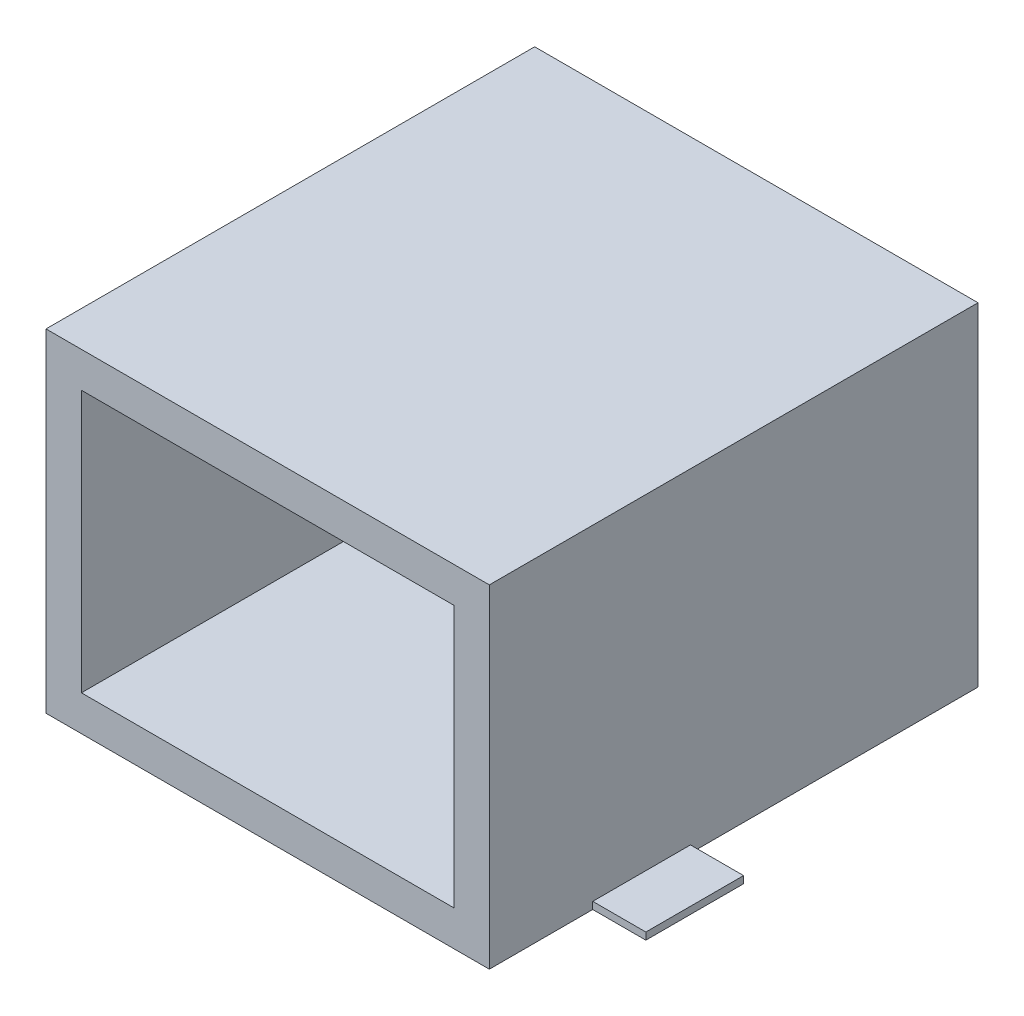
ISO-10303-21;
HEADER;
FILE_DESCRIPTION(('STEP AP214'),'2;1');
FILE_NAME('part.step','',(''),(''),'','','');
FILE_SCHEMA(('AUTOMOTIVE_DESIGN { 1 0 10303 214 1 1 1 1 }'));
ENDSEC;
DATA;
#1=APPLICATION_CONTEXT('core data for automotive mechanical design processes');
#2=APPLICATION_PROTOCOL_DEFINITION('international standard','automotive_design',2000,#1);
#3=PRODUCT_CONTEXT('',#1,'mechanical');
#4=PRODUCT('Part','Part','',(#3));
#5=PRODUCT_RELATED_PRODUCT_CATEGORY('part','',(#4));
#6=PRODUCT_DEFINITION_FORMATION('','',#4);
#7=PRODUCT_DEFINITION_CONTEXT('part definition',#1,'design');
#8=PRODUCT_DEFINITION('design','',#6,#7);
#9=PRODUCT_DEFINITION_SHAPE('','',#8);
#10=(LENGTH_UNIT() NAMED_UNIT(*) SI_UNIT(.MILLI.,.METRE.));
#11=(NAMED_UNIT(*) PLANE_ANGLE_UNIT() SI_UNIT($,.RADIAN.));
#12=(NAMED_UNIT(*) SI_UNIT($,.STERADIAN.) SOLID_ANGLE_UNIT());
#13=UNCERTAINTY_MEASURE_WITH_UNIT(LENGTH_MEASURE(1.E-05),#10,'distance_accuracy_value','');
#14=(GEOMETRIC_REPRESENTATION_CONTEXT(3) GLOBAL_UNCERTAINTY_ASSIGNED_CONTEXT((#13)) GLOBAL_UNIT_ASSIGNED_CONTEXT((#10,
#11,#12)) REPRESENTATION_CONTEXT('',''));
#15=CARTESIAN_POINT('',(0.,0.,0.));
#16=DIRECTION('',(0.,0.,1.));
#17=DIRECTION('',(1.,0.,0.));
#18=AXIS2_PLACEMENT_3D('',#15,#16,#17);
#19=CARTESIAN_POINT('',(0.,0.,0.));
#20=DIRECTION('',(0.,0.,-1.));
#21=DIRECTION('',(-1.,0.,0.));
#22=AXIS2_PLACEMENT_3D('',#19,#20,#21);
#23=PLANE('',#22);
#24=DIRECTION('',(0.,1.,0.));
#25=VECTOR('',#24,1.);
#26=CARTESIAN_POINT('',(7.9502,-5.969,0.));
#27=LINE('',#26,#25);
#28=CARTESIAN_POINT('',(7.9502,-5.969,0.));
#29=VERTEX_POINT('',#28);
#30=CARTESIAN_POINT('',(7.9502,5.969,0.));
#31=VERTEX_POINT('',#30);
#32=EDGE_CURVE('E248',#29,#31,#27,.T.);
#33=ORIENTED_EDGE('',*,*,#32,.T.);
#34=DIRECTION('',(-1.,0.,0.));
#35=VECTOR('',#34,1.);
#36=CARTESIAN_POINT('',(-7.9502,5.969,0.));
#37=LINE('',#36,#35);
#38=CARTESIAN_POINT('',(-7.9502,5.969,0.));
#39=VERTEX_POINT('',#38);
#40=EDGE_CURVE('E308',#31,#39,#37,.T.);
#41=ORIENTED_EDGE('',*,*,#40,.T.);
#42=DIRECTION('',(0.,-1.,0.));
#43=VECTOR('',#42,1.);
#44=CARTESIAN_POINT('',(-7.9502,-5.969,0.));
#45=LINE('',#44,#43);
#46=CARTESIAN_POINT('',(-7.9502,-5.969,0.));
#47=VERTEX_POINT('',#46);
#48=EDGE_CURVE('E312',#39,#47,#45,.T.);
#49=ORIENTED_EDGE('',*,*,#48,.T.);
#50=DIRECTION('',(1.,0.,0.));
#51=VECTOR('',#50,1.);
#52=CARTESIAN_POINT('',(-7.9502,-5.969,0.));
#53=LINE('',#52,#51);
#54=EDGE_CURVE('E293',#47,#29,#53,.T.);
#55=ORIENTED_EDGE('',*,*,#54,.T.);
#56=EDGE_LOOP('',(#33,#41,#49,#55));
#57=FACE_BOUND('',#56,.T.);
#58=DIRECTION('',(0.,1.,0.));
#59=VECTOR('',#58,1.);
#60=CARTESIAN_POINT('',(6.6802,-5.969,0.));
#61=LINE('',#60,#59);
#62=CARTESIAN_POINT('',(6.6802,-4.699,0.));
#63=VERTEX_POINT('',#62);
#64=CARTESIAN_POINT('',(6.6802,4.699,0.));
#65=VERTEX_POINT('',#64);
#66=EDGE_CURVE('E236',#63,#65,#61,.T.);
#67=ORIENTED_EDGE('',*,*,#66,.F.);
#68=DIRECTION('',(1.,0.,0.));
#69=VECTOR('',#68,1.);
#70=CARTESIAN_POINT('',(-7.9502,-4.699,0.));
#71=LINE('',#70,#69);
#72=CARTESIAN_POINT('',(-6.6802,-4.699,0.));
#73=VERTEX_POINT('',#72);
#74=EDGE_CURVE('E255',#73,#63,#71,.T.);
#75=ORIENTED_EDGE('',*,*,#74,.F.);
#76=DIRECTION('',(0.,-1.,0.));
#77=VECTOR('',#76,1.);
#78=CARTESIAN_POINT('',(-6.6802,-5.969,0.));
#79=LINE('',#78,#77);
#80=CARTESIAN_POINT('',(-6.6802,4.699,0.));
#81=VERTEX_POINT('',#80);
#82=EDGE_CURVE('E282',#81,#73,#79,.T.);
#83=ORIENTED_EDGE('',*,*,#82,.F.);
#84=DIRECTION('',(-1.,0.,0.));
#85=VECTOR('',#84,1.);
#86=CARTESIAN_POINT('',(-7.9502,4.699,0.));
#87=LINE('',#86,#85);
#88=EDGE_CURVE('E278',#65,#81,#87,.T.);
#89=ORIENTED_EDGE('',*,*,#88,.F.);
#90=EDGE_LOOP('',(#67,#75,#83,#89));
#91=FACE_BOUND('',#90,.T.);
#92=ADVANCED_FACE('F43',(#57,#91),#23,.F.);
#93=CARTESIAN_POINT('',(7.9502,-5.969,-17.526));
#94=DIRECTION('',(1.,0.,0.));
#95=DIRECTION('',(0.,0.,-1.));
#96=AXIS2_PLACEMENT_3D('',#93,#94,#95);
#97=PLANE('',#96);
#98=DIRECTION('',(0.,-1.,0.));
#99=VECTOR('',#98,1.);
#100=CARTESIAN_POINT('',(7.9502,-5.715,-3.7084));
#101=LINE('',#100,#99);
#102=CARTESIAN_POINT('',(7.9502,-5.715,-3.7084));
#103=VERTEX_POINT('',#102);
#104=CARTESIAN_POINT('',(7.9502,-5.969,-3.7084));
#105=VERTEX_POINT('',#104);
#106=EDGE_CURVE('E180',#103,#105,#101,.T.);
#107=ORIENTED_EDGE('',*,*,#106,.F.);
#108=DIRECTION('',(0.,0.,1.));
#109=VECTOR('',#108,1.);
#110=CARTESIAN_POINT('',(7.9502,-5.715,-3.7084));
#111=LINE('',#110,#109);
#112=CARTESIAN_POINT('',(7.9502,-5.715,-7.2136));
#113=VERTEX_POINT('',#112);
#114=EDGE_CURVE('E164',#113,#103,#111,.T.);
#115=ORIENTED_EDGE('',*,*,#114,.F.);
#116=DIRECTION('',(0.,-1.,0.));
#117=VECTOR('',#116,1.);
#118=CARTESIAN_POINT('',(7.9502,-5.715,-7.2136));
#119=LINE('',#118,#117);
#120=CARTESIAN_POINT('',(7.9502,-5.969,-7.2136));
#121=VERTEX_POINT('',#120);
#122=EDGE_CURVE('E171',#113,#121,#119,.T.);
#123=ORIENTED_EDGE('',*,*,#122,.T.);
#124=DIRECTION('',(0.,0.,1.));
#125=VECTOR('',#124,1.);
#126=CARTESIAN_POINT('',(7.9502,-5.969,-17.526));
#127=LINE('',#126,#125);
#128=CARTESIAN_POINT('',(7.9502,-5.969,-17.526));
#129=VERTEX_POINT('',#128);
#130=EDGE_CURVE('E11',#129,#121,#127,.T.);
#131=ORIENTED_EDGE('',*,*,#130,.F.);
#132=DIRECTION('',(0.,1.,0.));
#133=VECTOR('',#132,1.);
#134=CARTESIAN_POINT('',(7.9502,-5.969,-17.526));
#135=LINE('',#134,#133);
#136=CARTESIAN_POINT('',(7.9502,5.969,-17.526));
#137=VERTEX_POINT('',#136);
#138=EDGE_CURVE('E288',#129,#137,#135,.T.);
#139=ORIENTED_EDGE('',*,*,#138,.T.);
#140=DIRECTION('',(0.,0.,1.));
#141=VECTOR('',#140,1.);
#142=CARTESIAN_POINT('',(7.9502,5.969,-17.526));
#143=LINE('',#142,#141);
#144=EDGE_CURVE('E47',#137,#31,#143,.T.);
#145=ORIENTED_EDGE('',*,*,#144,.T.);
#146=ORIENTED_EDGE('',*,*,#32,.F.);
#147=EDGE_CURVE('E53',#105,#29,#127,.T.);
#148=ORIENTED_EDGE('',*,*,#147,.F.);
#149=EDGE_LOOP('',(#107,#115,#123,#131,#139,#145,#146,#148));
#150=FACE_BOUND('',#149,.T.);
#151=ADVANCED_FACE('F45',(#150),#97,.T.);
#152=CARTESIAN_POINT('',(-7.9502,-5.969,-17.526));
#153=DIRECTION('',(0.,-1.,0.));
#154=DIRECTION('',(0.,0.,-1.));
#155=AXIS2_PLACEMENT_3D('',#152,#153,#154);
#156=PLANE('',#155);
#157=ORIENTED_EDGE('',*,*,#54,.F.);
#158=DIRECTION('',(0.,0.,1.));
#159=VECTOR('',#158,1.);
#160=CARTESIAN_POINT('',(-7.9502,-5.969,-17.526));
#161=LINE('',#160,#159);
#162=CARTESIAN_POINT('',(-7.9502,-5.969,-3.7084));
#163=VERTEX_POINT('',#162);
#164=EDGE_CURVE('E322',#163,#47,#161,.T.);
#165=ORIENTED_EDGE('',*,*,#164,.F.);
#166=DIRECTION('',(-1.,0.,0.));
#167=VECTOR('',#166,1.);
#168=CARTESIAN_POINT('',(-7.9502,-5.969,-3.7084));
#169=LINE('',#168,#167);
#170=CARTESIAN_POINT('',(-9.8552,-5.969,-3.7084));
#171=VERTEX_POINT('',#170);
#172=EDGE_CURVE('E69',#163,#171,#169,.T.);
#173=ORIENTED_EDGE('',*,*,#172,.T.);
#174=DIRECTION('',(0.,0.,-1.));
#175=VECTOR('',#174,1.);
#176=CARTESIAN_POINT('',(-9.8552,-5.969,-3.7084));
#177=LINE('',#176,#175);
#178=CARTESIAN_POINT('',(-9.8552,-5.969,-7.2136));
#179=VERTEX_POINT('',#178);
#180=EDGE_CURVE('E226',#171,#179,#177,.T.);
#181=ORIENTED_EDGE('',*,*,#180,.T.);
#182=DIRECTION('',(1.,0.,0.));
#183=VECTOR('',#182,1.);
#184=CARTESIAN_POINT('',(-7.9502,-5.969,-7.2136));
#185=LINE('',#184,#183);
#186=CARTESIAN_POINT('',(-7.9502,-5.969,-7.2136));
#187=VERTEX_POINT('',#186);
#188=EDGE_CURVE('E211',#179,#187,#185,.T.);
#189=ORIENTED_EDGE('',*,*,#188,.T.);
#190=CARTESIAN_POINT('',(-7.9502,-5.969,-17.526));
#191=VERTEX_POINT('',#190);
#192=EDGE_CURVE('E319',#191,#187,#161,.T.);
#193=ORIENTED_EDGE('',*,*,#192,.F.);
#194=DIRECTION('',(1.,0.,0.));
#195=VECTOR('',#194,1.);
#196=CARTESIAN_POINT('',(-7.9502,-5.969,-17.526));
#197=LINE('',#196,#195);
#198=EDGE_CURVE('E301',#191,#129,#197,.T.);
#199=ORIENTED_EDGE('',*,*,#198,.T.);
#200=ORIENTED_EDGE('',*,*,#130,.T.);
#201=DIRECTION('',(-1.,0.,0.));
#202=VECTOR('',#201,1.);
#203=CARTESIAN_POINT('',(7.9502,-5.969,-7.2136));
#204=LINE('',#203,#202);
#205=CARTESIAN_POINT('',(9.8552,-5.969,-7.2136));
#206=VERTEX_POINT('',#205);
#207=EDGE_CURVE('E61',#206,#121,#204,.T.);
#208=ORIENTED_EDGE('',*,*,#207,.F.);
#209=DIRECTION('',(0.,0.,-1.));
#210=VECTOR('',#209,1.);
#211=CARTESIAN_POINT('',(9.8552,-5.969,-3.7084));
#212=LINE('',#211,#210);
#213=CARTESIAN_POINT('',(9.8552,-5.969,-3.7084));
#214=VERTEX_POINT('',#213);
#215=EDGE_CURVE('E187',#214,#206,#212,.T.);
#216=ORIENTED_EDGE('',*,*,#215,.F.);
#217=DIRECTION('',(1.,0.,0.));
#218=VECTOR('',#217,1.);
#219=CARTESIAN_POINT('',(7.9502,-5.969,-3.7084));
#220=LINE('',#219,#218);
#221=EDGE_CURVE('E182',#105,#214,#220,.T.);
#222=ORIENTED_EDGE('',*,*,#221,.F.);
#223=ORIENTED_EDGE('',*,*,#147,.T.);
#224=EDGE_LOOP('',(#157,#165,#173,#181,#189,#193,#199,#200,#208,#216,#222,#223));
#225=FACE_BOUND('',#224,.T.);
#226=ADVANCED_FACE('F341',(#225),#156,.T.);
#227=CARTESIAN_POINT('',(-7.9502,-5.969,-17.526));
#228=DIRECTION('',(-1.,0.,0.));
#229=DIRECTION('',(0.,0.,1.));
#230=AXIS2_PLACEMENT_3D('',#227,#228,#229);
#231=PLANE('',#230);
#232=DIRECTION('',(0.,-1.,0.));
#233=VECTOR('',#232,1.);
#234=CARTESIAN_POINT('',(-7.9502,-5.715,-7.2136));
#235=LINE('',#234,#233);
#236=CARTESIAN_POINT('',(-7.9502,-5.715,-7.2136));
#237=VERTEX_POINT('',#236);
#238=EDGE_CURVE('E233',#237,#187,#235,.T.);
#239=ORIENTED_EDGE('',*,*,#238,.F.);
#240=DIRECTION('',(0.,0.,1.));
#241=VECTOR('',#240,1.);
#242=CARTESIAN_POINT('',(-7.9502,-5.715,-3.7084));
#243=LINE('',#242,#241);
#244=CARTESIAN_POINT('',(-7.9502,-5.715,-3.7084));
#245=VERTEX_POINT('',#244);
#246=EDGE_CURVE('E206',#237,#245,#243,.T.);
#247=ORIENTED_EDGE('',*,*,#246,.T.);
#248=DIRECTION('',(0.,-1.,0.));
#249=VECTOR('',#248,1.);
#250=CARTESIAN_POINT('',(-7.9502,-5.715,-3.7084));
#251=LINE('',#250,#249);
#252=EDGE_CURVE('E223',#245,#163,#251,.T.);
#253=ORIENTED_EDGE('',*,*,#252,.T.);
#254=ORIENTED_EDGE('',*,*,#164,.T.);
#255=ORIENTED_EDGE('',*,*,#48,.F.);
#256=DIRECTION('',(0.,0.,1.));
#257=VECTOR('',#256,1.);
#258=CARTESIAN_POINT('',(-7.9502,5.969,-17.526));
#259=LINE('',#258,#257);
#260=CARTESIAN_POINT('',(-7.9502,5.969,-17.526));
#261=VERTEX_POINT('',#260);
#262=EDGE_CURVE('E323',#261,#39,#259,.T.);
#263=ORIENTED_EDGE('',*,*,#262,.F.);
#264=DIRECTION('',(0.,-1.,0.));
#265=VECTOR('',#264,1.);
#266=CARTESIAN_POINT('',(-7.9502,-5.969,-17.526));
#267=LINE('',#266,#265);
#268=EDGE_CURVE('E297',#261,#191,#267,.T.);
#269=ORIENTED_EDGE('',*,*,#268,.T.);
#270=ORIENTED_EDGE('',*,*,#192,.T.);
#271=EDGE_LOOP('',(#239,#247,#253,#254,#255,#263,#269,#270));
#272=FACE_BOUND('',#271,.T.);
#273=ADVANCED_FACE('F400',(#272),#231,.T.);
#274=CARTESIAN_POINT('',(-7.9502,5.969,-17.526));
#275=DIRECTION('',(0.,1.,0.));
#276=DIRECTION('',(0.,0.,1.));
#277=AXIS2_PLACEMENT_3D('',#274,#275,#276);
#278=PLANE('',#277);
#279=ORIENTED_EDGE('',*,*,#40,.F.);
#280=ORIENTED_EDGE('',*,*,#144,.F.);
#281=DIRECTION('',(-1.,0.,0.));
#282=VECTOR('',#281,1.);
#283=CARTESIAN_POINT('',(-7.9502,5.969,-17.526));
#284=LINE('',#283,#282);
#285=EDGE_CURVE('E292',#137,#261,#284,.T.);
#286=ORIENTED_EDGE('',*,*,#285,.T.);
#287=ORIENTED_EDGE('',*,*,#262,.T.);
#288=EDGE_LOOP('',(#279,#280,#286,#287));
#289=FACE_BOUND('',#288,.T.);
#290=ADVANCED_FACE('F335',(#289),#278,.T.);
#291=CARTESIAN_POINT('',(0.,0.,-17.526));
#292=DIRECTION('',(0.,0.,-1.));
#293=DIRECTION('',(-1.,0.,0.));
#294=AXIS2_PLACEMENT_3D('',#291,#292,#293);
#295=PLANE('',#294);
#296=ORIENTED_EDGE('',*,*,#138,.F.);
#297=ORIENTED_EDGE('',*,*,#198,.F.);
#298=ORIENTED_EDGE('',*,*,#268,.F.);
#299=ORIENTED_EDGE('',*,*,#285,.F.);
#300=EDGE_LOOP('',(#296,#297,#298,#299));
#301=FACE_BOUND('',#300,.T.);
#302=ADVANCED_FACE('F396',(#301),#295,.T.);
#303=CARTESIAN_POINT('',(6.6802,-5.969,-17.526));
#304=DIRECTION('',(1.,0.,0.));
#305=DIRECTION('',(0.,0.,-1.));
#306=AXIS2_PLACEMENT_3D('',#303,#304,#305);
#307=PLANE('',#306);
#308=ORIENTED_EDGE('',*,*,#66,.T.);
#309=DIRECTION('',(0.,0.,1.));
#310=VECTOR('',#309,1.);
#311=CARTESIAN_POINT('',(6.6802,4.699,-17.526));
#312=LINE('',#311,#310);
#313=CARTESIAN_POINT('',(6.6802,4.699,-16.256));
#314=VERTEX_POINT('',#313);
#315=EDGE_CURVE('E256',#314,#65,#312,.T.);
#316=ORIENTED_EDGE('',*,*,#315,.F.);
#317=DIRECTION('',(0.,1.,0.));
#318=VECTOR('',#317,1.);
#319=CARTESIAN_POINT('',(6.6802,-5.969,-16.256));
#320=LINE('',#319,#318);
#321=CARTESIAN_POINT('',(6.6802,-4.699,-16.256));
#322=VERTEX_POINT('',#321);
#323=EDGE_CURVE('E250',#322,#314,#320,.T.);
#324=ORIENTED_EDGE('',*,*,#323,.F.);
#325=DIRECTION('',(0.,0.,1.));
#326=VECTOR('',#325,1.);
#327=CARTESIAN_POINT('',(6.6802,-4.699,-17.526));
#328=LINE('',#327,#326);
#329=EDGE_CURVE('E245',#322,#63,#328,.T.);
#330=ORIENTED_EDGE('',*,*,#329,.T.);
#331=EDGE_LOOP('',(#308,#316,#324,#330));
#332=FACE_BOUND('',#331,.T.);
#333=ADVANCED_FACE('F439',(#332),#307,.F.);
#334=CARTESIAN_POINT('',(-7.9502,-4.699,-17.526));
#335=DIRECTION('',(0.,-1.,0.));
#336=DIRECTION('',(0.,0.,-1.));
#337=AXIS2_PLACEMENT_3D('',#334,#335,#336);
#338=PLANE('',#337);
#339=ORIENTED_EDGE('',*,*,#74,.T.);
#340=ORIENTED_EDGE('',*,*,#329,.F.);
#341=DIRECTION('',(1.,0.,0.));
#342=VECTOR('',#341,1.);
#343=CARTESIAN_POINT('',(-7.9502,-4.699,-16.256));
#344=LINE('',#343,#342);
#345=CARTESIAN_POINT('',(-6.6802,-4.699,-16.256));
#346=VERTEX_POINT('',#345);
#347=EDGE_CURVE('E260',#346,#322,#344,.T.);
#348=ORIENTED_EDGE('',*,*,#347,.F.);
#349=DIRECTION('',(0.,0.,1.));
#350=VECTOR('',#349,1.);
#351=CARTESIAN_POINT('',(-6.6802,-4.699,-17.526));
#352=LINE('',#351,#350);
#353=EDGE_CURVE('E249',#346,#73,#352,.T.);
#354=ORIENTED_EDGE('',*,*,#353,.T.);
#355=EDGE_LOOP('',(#339,#340,#348,#354));
#356=FACE_BOUND('',#355,.T.);
#357=ADVANCED_FACE('F443',(#356),#338,.F.);
#358=CARTESIAN_POINT('',(-6.6802,-5.969,-17.526));
#359=DIRECTION('',(-1.,0.,0.));
#360=DIRECTION('',(0.,0.,1.));
#361=AXIS2_PLACEMENT_3D('',#358,#359,#360);
#362=PLANE('',#361);
#363=ORIENTED_EDGE('',*,*,#82,.T.);
#364=ORIENTED_EDGE('',*,*,#353,.F.);
#365=DIRECTION('',(0.,-1.,0.));
#366=VECTOR('',#365,1.);
#367=CARTESIAN_POINT('',(-6.6802,-5.969,-16.256));
#368=LINE('',#367,#366);
#369=CARTESIAN_POINT('',(-6.6802,4.699,-16.256));
#370=VERTEX_POINT('',#369);
#371=EDGE_CURVE('E267',#370,#346,#368,.T.);
#372=ORIENTED_EDGE('',*,*,#371,.F.);
#373=DIRECTION('',(0.,0.,1.));
#374=VECTOR('',#373,1.);
#375=CARTESIAN_POINT('',(-6.6802,4.699,-17.526));
#376=LINE('',#375,#374);
#377=EDGE_CURVE('E259',#370,#81,#376,.T.);
#378=ORIENTED_EDGE('',*,*,#377,.T.);
#379=EDGE_LOOP('',(#363,#364,#372,#378));
#380=FACE_BOUND('',#379,.T.);
#381=ADVANCED_FACE('F449',(#380),#362,.F.);
#382=CARTESIAN_POINT('',(-7.9502,4.699,-17.526));
#383=DIRECTION('',(0.,1.,0.));
#384=DIRECTION('',(0.,0.,1.));
#385=AXIS2_PLACEMENT_3D('',#382,#383,#384);
#386=PLANE('',#385);
#387=ORIENTED_EDGE('',*,*,#88,.T.);
#388=ORIENTED_EDGE('',*,*,#377,.F.);
#389=DIRECTION('',(-1.,0.,0.));
#390=VECTOR('',#389,1.);
#391=CARTESIAN_POINT('',(-7.9502,4.699,-16.256));
#392=LINE('',#391,#390);
#393=EDGE_CURVE('E254',#314,#370,#392,.T.);
#394=ORIENTED_EDGE('',*,*,#393,.F.);
#395=ORIENTED_EDGE('',*,*,#315,.T.);
#396=EDGE_LOOP('',(#387,#388,#394,#395));
#397=FACE_BOUND('',#396,.T.);
#398=ADVANCED_FACE('F421',(#397),#386,.F.);
#399=CARTESIAN_POINT('',(0.,0.,-16.256));
#400=DIRECTION('',(0.,0.,-1.));
#401=DIRECTION('',(-1.,0.,0.));
#402=AXIS2_PLACEMENT_3D('',#399,#400,#401);
#403=PLANE('',#402);
#404=ORIENTED_EDGE('',*,*,#323,.T.);
#405=ORIENTED_EDGE('',*,*,#393,.T.);
#406=ORIENTED_EDGE('',*,*,#371,.T.);
#407=ORIENTED_EDGE('',*,*,#347,.T.);
#408=EDGE_LOOP('',(#404,#405,#406,#407));
#409=FACE_BOUND('',#408,.T.);
#410=ADVANCED_FACE('F414',(#409),#403,.F.);
#411=CARTESIAN_POINT('',(-7.9502,-5.715,-7.2136));
#412=DIRECTION('',(0.,0.,-1.));
#413=DIRECTION('',(-1.,0.,0.));
#414=AXIS2_PLACEMENT_3D('',#411,#412,#413);
#415=PLANE('',#414);
#416=ORIENTED_EDGE('',*,*,#188,.F.);
#417=DIRECTION('',(0.,-1.,0.));
#418=VECTOR('',#417,1.);
#419=CARTESIAN_POINT('',(-9.8552,-5.715,-7.2136));
#420=LINE('',#419,#418);
#421=CARTESIAN_POINT('',(-9.8552,-5.715,-7.2136));
#422=VERTEX_POINT('',#421);
#423=EDGE_CURVE('E237',#422,#179,#420,.T.);
#424=ORIENTED_EDGE('',*,*,#423,.F.);
#425=DIRECTION('',(1.,0.,0.));
#426=VECTOR('',#425,1.);
#427=CARTESIAN_POINT('',(-7.9502,-5.715,-7.2136));
#428=LINE('',#427,#426);
#429=EDGE_CURVE('E219',#422,#237,#428,.T.);
#430=ORIENTED_EDGE('',*,*,#429,.T.);
#431=ORIENTED_EDGE('',*,*,#238,.T.);
#432=EDGE_LOOP('',(#416,#424,#430,#431));
#433=FACE_BOUND('',#432,.T.);
#434=ADVANCED_FACE('F412',(#433),#415,.T.);
#435=CARTESIAN_POINT('',(-9.8552,-5.715,-3.7084));
#436=DIRECTION('',(-1.,0.,0.));
#437=DIRECTION('',(0.,0.,1.));
#438=AXIS2_PLACEMENT_3D('',#435,#436,#437);
#439=PLANE('',#438);
#440=ORIENTED_EDGE('',*,*,#180,.F.);
#441=DIRECTION('',(0.,-1.,0.));
#442=VECTOR('',#441,1.);
#443=CARTESIAN_POINT('',(-9.8552,-5.715,-3.7084));
#444=LINE('',#443,#442);
#445=CARTESIAN_POINT('',(-9.8552,-5.715,-3.7084));
#446=VERTEX_POINT('',#445);
#447=EDGE_CURVE('E240',#446,#171,#444,.T.);
#448=ORIENTED_EDGE('',*,*,#447,.F.);
#449=DIRECTION('',(0.,0.,-1.));
#450=VECTOR('',#449,1.);
#451=CARTESIAN_POINT('',(-9.8552,-5.715,-3.7084));
#452=LINE('',#451,#450);
#453=EDGE_CURVE('E215',#446,#422,#452,.T.);
#454=ORIENTED_EDGE('',*,*,#453,.T.);
#455=ORIENTED_EDGE('',*,*,#423,.T.);
#456=EDGE_LOOP('',(#440,#448,#454,#455));
#457=FACE_BOUND('',#456,.T.);
#458=ADVANCED_FACE('F409',(#457),#439,.T.);
#459=CARTESIAN_POINT('',(-7.9502,-5.715,-3.7084));
#460=DIRECTION('',(0.,0.,1.));
#461=DIRECTION('',(1.,0.,0.));
#462=AXIS2_PLACEMENT_3D('',#459,#460,#461);
#463=PLANE('',#462);
#464=ORIENTED_EDGE('',*,*,#172,.F.);
#465=ORIENTED_EDGE('',*,*,#252,.F.);
#466=DIRECTION('',(-1.,0.,0.));
#467=VECTOR('',#466,1.);
#468=CARTESIAN_POINT('',(-7.9502,-5.715,-3.7084));
#469=LINE('',#468,#467);
#470=EDGE_CURVE('E210',#245,#446,#469,.T.);
#471=ORIENTED_EDGE('',*,*,#470,.T.);
#472=ORIENTED_EDGE('',*,*,#447,.T.);
#473=EDGE_LOOP('',(#464,#465,#471,#472));
#474=FACE_BOUND('',#473,.T.);
#475=ADVANCED_FACE('F402',(#474),#463,.T.);
#476=CARTESIAN_POINT('',(0.,-5.715,0.));
#477=DIRECTION('',(0.,1.,0.));
#478=DIRECTION('',(0.,0.,1.));
#479=AXIS2_PLACEMENT_3D('',#476,#477,#478);
#480=PLANE('',#479);
#481=ORIENTED_EDGE('',*,*,#246,.F.);
#482=ORIENTED_EDGE('',*,*,#429,.F.);
#483=ORIENTED_EDGE('',*,*,#453,.F.);
#484=ORIENTED_EDGE('',*,*,#470,.F.);
#485=EDGE_LOOP('',(#481,#482,#483,#484));
#486=FACE_BOUND('',#485,.T.);
#487=ADVANCED_FACE('F405',(#486),#480,.T.);
#488=CARTESIAN_POINT('',(7.9502,-5.715,-3.7084));
#489=DIRECTION('',(0.,0.,-1.));
#490=DIRECTION('',(-1.,0.,0.));
#491=AXIS2_PLACEMENT_3D('',#488,#489,#490);
#492=PLANE('',#491);
#493=ORIENTED_EDGE('',*,*,#221,.T.);
#494=DIRECTION('',(0.,-1.,0.));
#495=VECTOR('',#494,1.);
#496=CARTESIAN_POINT('',(9.8552,-5.715,-3.7084));
#497=LINE('',#496,#495);
#498=CARTESIAN_POINT('',(9.8552,-5.715,-3.7084));
#499=VERTEX_POINT('',#498);
#500=EDGE_CURVE('E200',#499,#214,#497,.T.);
#501=ORIENTED_EDGE('',*,*,#500,.F.);
#502=DIRECTION('',(1.,0.,0.));
#503=VECTOR('',#502,1.);
#504=CARTESIAN_POINT('',(7.9502,-5.715,-3.7084));
#505=LINE('',#504,#503);
#506=EDGE_CURVE('E176',#103,#499,#505,.T.);
#507=ORIENTED_EDGE('',*,*,#506,.F.);
#508=ORIENTED_EDGE('',*,*,#106,.T.);
#509=EDGE_LOOP('',(#493,#501,#507,#508));
#510=FACE_BOUND('',#509,.T.);
#511=ADVANCED_FACE('F391',(#510),#492,.F.);
#512=CARTESIAN_POINT('',(9.8552,-5.715,-3.7084));
#513=DIRECTION('',(-1.,0.,0.));
#514=DIRECTION('',(0.,0.,1.));
#515=AXIS2_PLACEMENT_3D('',#512,#513,#514);
#516=PLANE('',#515);
#517=ORIENTED_EDGE('',*,*,#215,.T.);
#518=DIRECTION('',(0.,-1.,0.));
#519=VECTOR('',#518,1.);
#520=CARTESIAN_POINT('',(9.8552,-5.715,-7.2136));
#521=LINE('',#520,#519);
#522=CARTESIAN_POINT('',(9.8552,-5.715,-7.2136));
#523=VERTEX_POINT('',#522);
#524=EDGE_CURVE('E175',#523,#206,#521,.T.);
#525=ORIENTED_EDGE('',*,*,#524,.F.);
#526=DIRECTION('',(0.,0.,-1.));
#527=VECTOR('',#526,1.);
#528=CARTESIAN_POINT('',(9.8552,-5.715,-3.7084));
#529=LINE('',#528,#527);
#530=EDGE_CURVE('E167',#499,#523,#529,.T.);
#531=ORIENTED_EDGE('',*,*,#530,.F.);
#532=ORIENTED_EDGE('',*,*,#500,.T.);
#533=EDGE_LOOP('',(#517,#525,#531,#532));
#534=FACE_BOUND('',#533,.T.);
#535=ADVANCED_FACE('F393',(#534),#516,.F.);
#536=CARTESIAN_POINT('',(7.9502,-5.715,-7.2136));
#537=DIRECTION('',(0.,0.,1.));
#538=DIRECTION('',(1.,0.,0.));
#539=AXIS2_PLACEMENT_3D('',#536,#537,#538);
#540=PLANE('',#539);
#541=ORIENTED_EDGE('',*,*,#207,.T.);
#542=ORIENTED_EDGE('',*,*,#122,.F.);
#543=DIRECTION('',(-1.,0.,0.));
#544=VECTOR('',#543,1.);
#545=CARTESIAN_POINT('',(7.9502,-5.715,-7.2136));
#546=LINE('',#545,#544);
#547=EDGE_CURVE('E161',#523,#113,#546,.T.);
#548=ORIENTED_EDGE('',*,*,#547,.F.);
#549=ORIENTED_EDGE('',*,*,#524,.T.);
#550=EDGE_LOOP('',(#541,#542,#548,#549));
#551=FACE_BOUND('',#550,.T.);
#552=ADVANCED_FACE('F172',(#551),#540,.F.);
#553=CARTESIAN_POINT('',(0.,-5.715,0.));
#554=DIRECTION('',(0.,1.,0.));
#555=DIRECTION('',(0.,0.,1.));
#556=AXIS2_PLACEMENT_3D('',#553,#554,#555);
#557=PLANE('',#556);
#558=ORIENTED_EDGE('',*,*,#114,.T.);
#559=ORIENTED_EDGE('',*,*,#506,.T.);
#560=ORIENTED_EDGE('',*,*,#530,.T.);
#561=ORIENTED_EDGE('',*,*,#547,.T.);
#562=EDGE_LOOP('',(#558,#559,#560,#561));
#563=FACE_BOUND('',#562,.T.);
#564=ADVANCED_FACE('F162',(#563),#557,.T.);
#565=CLOSED_SHELL('',(#92,#151,#226,#273,#290,#302,#333,#357,#381,#398,#410,#434,#458,#475,#487,
#511,#535,#552,#564));
#566=MANIFOLD_SOLID_BREP('B2',#565);
#567=ADVANCED_BREP_SHAPE_REPRESENTATION('',(#18,#566),#14);
#568=SHAPE_DEFINITION_REPRESENTATION(#9,#567);
ENDSEC;
END-ISO-10303-21;
